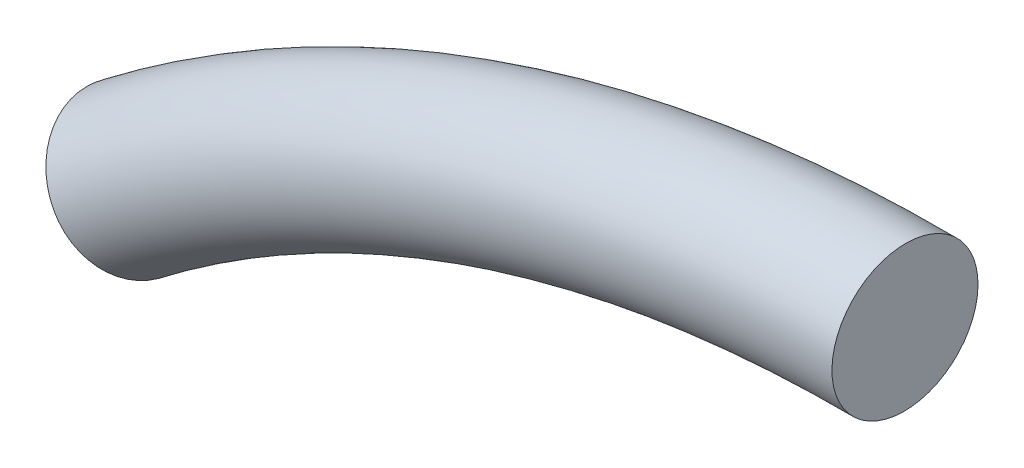
ISO-10303-21;
HEADER;
FILE_DESCRIPTION(('STEP AP214'),'2;1');
FILE_NAME('part.step','',(''),(''),'','','');
FILE_SCHEMA(('AUTOMOTIVE_DESIGN { 1 0 10303 214 1 1 1 1 }'));
ENDSEC;
DATA;
#1=APPLICATION_CONTEXT('core data for automotive mechanical design processes');
#2=APPLICATION_PROTOCOL_DEFINITION('international standard','automotive_design',2000,#1);
#3=PRODUCT_CONTEXT('',#1,'mechanical');
#4=PRODUCT('Part','Part','',(#3));
#5=PRODUCT_RELATED_PRODUCT_CATEGORY('part','',(#4));
#6=PRODUCT_DEFINITION_FORMATION('','',#4);
#7=PRODUCT_DEFINITION_CONTEXT('part definition',#1,'design');
#8=PRODUCT_DEFINITION('design','',#6,#7);
#9=PRODUCT_DEFINITION_SHAPE('','',#8);
#10=(LENGTH_UNIT() NAMED_UNIT(*) SI_UNIT(.MILLI.,.METRE.));
#11=(NAMED_UNIT(*) PLANE_ANGLE_UNIT() SI_UNIT($,.RADIAN.));
#12=(NAMED_UNIT(*) SI_UNIT($,.STERADIAN.) SOLID_ANGLE_UNIT());
#13=UNCERTAINTY_MEASURE_WITH_UNIT(LENGTH_MEASURE(1.E-05),#10,'distance_accuracy_value','');
#14=(GEOMETRIC_REPRESENTATION_CONTEXT(3) GLOBAL_UNCERTAINTY_ASSIGNED_CONTEXT((#13)) GLOBAL_UNIT_ASSIGNED_CONTEXT((#10,
#11,#12)) REPRESENTATION_CONTEXT('',''));
#15=CARTESIAN_POINT('',(0.,0.,0.));
#16=DIRECTION('',(0.,0.,1.));
#17=DIRECTION('',(1.,0.,0.));
#18=AXIS2_PLACEMENT_3D('',#15,#16,#17);
#19=CARTESIAN_POINT('',(0.,0.,-107.5));
#20=DIRECTION('',(0.999955923651329,-0.00938886332935335,0.));
#21=DIRECTION('',(0.00938886332935335,0.999955923651329,0.));
#22=AXIS2_PLACEMENT_3D('',#19,#20,#21);
#23=PLANE('',#22);
#24=CARTESIAN_POINT('',(0.0681835762520842,7.26185573027463,-102.2302));
#25=CARTESIAN_POINT('',(0.0681835589232626,7.26185388467768,-102.25265524156));
#26=CARTESIAN_POINT('',(0.0681657576199172,7.25995796627913,-102.275130857259));
#27=CARTESIAN_POINT('',(0.0680949382572513,7.2524153875108,-102.319482451298));
#28=CARTESIAN_POINT('',(0.0680418448261348,7.24676069970773,-102.341357041711));
#29=CARTESIAN_POINT('',(0.0679020229705332,7.23186904692079,-102.383809618347));
#30=CARTESIAN_POINT('',(0.067815354578601,7.22263847567222,-102.404389843003));
#31=CARTESIAN_POINT('',(0.0676106822649528,7.20083995914679,-102.443737337222));
#32=CARTESIAN_POINT('',(0.0674926338902818,7.18826727943147,-102.46250198299));
#33=CARTESIAN_POINT('',(0.067228803944301,7.16016821055959,-102.497627484938));
#34=CARTESIAN_POINT('',(0.0670830617132299,7.14464601131436,-102.513991693303));
#35=CARTESIAN_POINT('',(0.0667676445744993,7.11105267576022,-102.543904884907));
#36=CARTESIAN_POINT('',(0.0665979364490641,7.0929780016097,-102.557449895039));
#37=CARTESIAN_POINT('',(0.066239698530683,7.05482406156439,-102.581301941874));
#38=CARTESIAN_POINT('',(0.0660511825367067,7.03474626532158,-102.5916113298));
#39=CARTESIAN_POINT('',(0.0656605645775489,6.99314370615733,-102.608713483024));
#40=CARTESIAN_POINT('',(0.0654584618138845,6.9716188581939,-102.615506041437));
#41=CARTESIAN_POINT('',(0.0650464240342418,6.92773499237665,-102.625380612929));
#42=CARTESIAN_POINT('',(0.0648364892487736,6.90537599907318,-102.628462735124));
#43=CARTESIAN_POINT('',(0.0644147411796687,6.86045794401199,-102.630829316177));
#44=CARTESIAN_POINT('',(0.064202927896032,6.83789888225426,-102.630113775036));
#45=CARTESIAN_POINT('',(0.0637834293286717,6.79322040918673,-102.624905254934));
#46=CARTESIAN_POINT('',(0.0635757441665334,6.77110101082632,-102.620412164882));
#47=CARTESIAN_POINT('',(0.063170416447184,6.72793179643204,-102.607776350926));
#48=CARTESIAN_POINT('',(0.0629727733000141,6.70688191756491,-102.599633841699));
#49=CARTESIAN_POINT('',(0.0625929872389772,6.66643300398165,-102.579923114515));
#50=CARTESIAN_POINT('',(0.0624108557280838,6.64703518373318,-102.568352403919));
#51=CARTESIAN_POINT('',(0.0620676737526863,6.61048476893311,-102.542134850302));
#52=CARTESIAN_POINT('',(0.0619065941739791,6.59332907358869,-102.527492330157));
#53=CARTESIAN_POINT('',(0.0616095715876351,6.56169484010866,-102.495513974748));
#54=CARTESIAN_POINT('',(0.0614736643953467,6.54722011646778,-102.478174365578));
#55=CARTESIAN_POINT('',(0.0612313067299153,6.52140794148034,-102.441335318358));
#56=CARTESIAN_POINT('',(0.0611248146384191,6.51006605759308,-102.421838987082));
#57=CARTESIAN_POINT('',(0.0609438850957211,6.49079625233148,-102.381186262625));
#58=CARTESIAN_POINT('',(0.0608695051364039,6.48287445409989,-102.36002697154));
#59=CARTESIAN_POINT('',(0.0607553226134225,6.47071350487448,-102.316713490036));
#60=CARTESIAN_POINT('',(0.0607154464644752,6.46646651671901,-102.294561523395));
#61=CARTESIAN_POINT('',(0.0606794150799669,6.46262901316686,-102.258269762147));
#62=CARTESIAN_POINT('',(0.060672474754741,6.46188983749903,-102.244238862857));
#63=CARTESIAN_POINT('',(0.0606725029174219,6.46189283695052,-102.20774475844));
#64=CARTESIAN_POINT('',(0.0606903042207651,6.46378875534907,-102.185269142741));
#65=CARTESIAN_POINT('',(0.060761123583431,6.47133133411741,-102.140917548703));
#66=CARTESIAN_POINT('',(0.0608142170145498,6.47698602192048,-102.119042958289));
#67=CARTESIAN_POINT('',(0.0609540388701514,6.49187767470741,-102.076590381653));
#68=CARTESIAN_POINT('',(0.0610407072620813,6.50110824595599,-102.056010156997));
#69=CARTESIAN_POINT('',(0.0612453795757295,6.52290676248142,-102.016662662778));
#70=CARTESIAN_POINT('',(0.0613634279504027,6.53547944219674,-101.99789801701));
#71=CARTESIAN_POINT('',(0.0616272578963835,6.56357851106861,-101.962772515062));
#72=CARTESIAN_POINT('',(0.0617730001274524,6.57910071031384,-101.946408306697));
#73=CARTESIAN_POINT('',(0.062088417266183,6.61269404586798,-101.916495115093));
#74=CARTESIAN_POINT('',(0.0622581253916204,6.6307687200185,-101.902950104961));
#75=CARTESIAN_POINT('',(0.0626163633100016,6.66892266006382,-101.879098058126));
#76=CARTESIAN_POINT('',(0.0628048793039756,6.68900045630662,-101.8687886702));
#77=CARTESIAN_POINT('',(0.0631954972631334,6.73060301547087,-101.851686516976));
#78=CARTESIAN_POINT('',(0.0633976000268001,6.7521278634343,-101.844893958563));
#79=CARTESIAN_POINT('',(0.0638096378064428,6.79601172925156,-101.835019387071));
#80=CARTESIAN_POINT('',(0.0640195725919088,6.81837072255502,-101.831937264876));
#81=CARTESIAN_POINT('',(0.0644413206610137,6.86328877761622,-101.829570683823));
#82=CARTESIAN_POINT('',(0.0646531339446526,6.88584783937395,-101.830286224964));
#83=CARTESIAN_POINT('',(0.0650726325120129,6.93052631244147,-101.835494745066));
#84=CARTESIAN_POINT('',(0.0652803176741489,6.95264571080189,-101.839987835118));
#85=CARTESIAN_POINT('',(0.0656856453934983,6.99581492519617,-101.852623649074));
#86=CARTESIAN_POINT('',(0.0658832885406704,7.01686480406329,-101.860766158301));
#87=CARTESIAN_POINT('',(0.0662630746017073,7.05731371764656,-101.880476885485));
#88=CARTESIAN_POINT('',(0.0664452061125985,7.07671153789502,-101.892047596081));
#89=CARTESIAN_POINT('',(0.066788388087996,7.1132619526951,-101.918265149698));
#90=CARTESIAN_POINT('',(0.0669494676667055,7.13041764803951,-101.932907669844));
#91=CARTESIAN_POINT('',(0.0672464902530494,7.16205188151955,-101.964886025252));
#92=CARTESIAN_POINT('',(0.0673823974453356,7.17652660516043,-101.982225634422));
#93=CARTESIAN_POINT('',(0.067624755110767,7.20233878014787,-102.019064681642));
#94=CARTESIAN_POINT('',(0.0677312472022654,7.21368066403513,-102.038561012918));
#95=CARTESIAN_POINT('',(0.0679121767449635,7.23295046929673,-102.079213737375));
#96=CARTESIAN_POINT('',(0.0679865567042786,7.24087226752831,-102.10037302846));
#97=CARTESIAN_POINT('',(0.0681007392272596,7.25303321675372,-102.143686509964));
#98=CARTESIAN_POINT('',(0.0681406153762084,7.2572802049092,-102.165838476605));
#99=CARTESIAN_POINT('',(0.0681766467607183,7.26111770846135,-102.202130237853));
#100=CARTESIAN_POINT('',(0.0681835870859444,7.26185688412918,-102.216161137143));
#101=CARTESIAN_POINT('',(0.0681835762520842,7.26185573027463,-102.2302));
#102=B_SPLINE_CURVE_WITH_KNOTS('',3,(#24,#25,#26,#27,#28,#29,#30,#31,#32,#33,#34,#35,#36,#37,
#38,#39,#40,#41,#42,#43,#44,#45,#46,#47,#48,#49,#50,#51,#52,#53,#54,#55,#56,#57,#58,#59,#60,#61,
#62,#63,#64,#65,#66,#67,#68,#69,#70,#71,#72,#73,#74,#75,#76,#77,#78,#79,#80,#81,#82,#83,#84,#85,
#86,#87,#88,#89,#90,#91,#92,#93,#94,#95,#96,#97,#98,#99,#100,#101),.UNSPECIFIED.,.T.,.F.,(4,2,2,
2,2,2,2,2,2,2,2,2,2,2,2,2,2,2,2,2,2,2,2,2,2,2,2,2,2,2,2,2,2,2,2,2,2,2,4),(0.,0.0673217190940811,
0.134787678055446,0.202133559490878,0.26957535641861,0.336922056232666,0.404363034793443,
0.47175489208364,0.53915071340354,0.606544552708794,0.673938392014052,0.741334213333949,
0.808726070624146,0.876167049184933,0.943513748998996,1.01095554592845,1.07830142736559,
1.1457673863287,1.21308910542448,1.25517818200736,1.32249990110144,1.3899658600628,
1.45731174149823,1.52475353842597,1.59210023824002,1.6595412168008,1.726933074091,
1.7943288954109,1.86172273471615,1.92911657402141,1.99651239534131,2.0639042526315,
2.13134523119229,2.19869193100635,2.2661337279358,2.33347960937294,2.40094556833606,
2.46826728743184,2.51035636401471),.UNSPECIFIED.);
#103=CARTESIAN_POINT('',(0.0681835762520842,7.26185573027463,-102.2302));
#104=VERTEX_POINT('',#103);
#105=EDGE_CURVE('E19',#104,#104,#102,.T.);
#106=ORIENTED_EDGE('',*,*,#105,.F.);
#107=EDGE_LOOP('',(#106));
#108=FACE_BOUND('',#107,.T.);
#109=ADVANCED_FACE('F15',(#108),#23,.T.);
#110=CARTESIAN_POINT('',(0.,0.,-107.5));
#111=DIRECTION('',(0.793756382418969,0.608235813948135,0.));
#112=DIRECTION('',(-0.608235813948135,0.793756382418969,0.));
#113=AXIS2_PLACEMENT_3D('',#110,#111,#112);
#114=PLANE('',#113);
#115=CARTESIAN_POINT('',(-3.93052677003847,5.12939330181018,-102.2302));
#116=CARTESIAN_POINT('',(-3.93052789264611,5.12939476682911,-102.25265524156));
#117=CARTESIAN_POINT('',(-3.931681108946,5.13089973049181,-102.275130857259));
#118=CARTESIAN_POINT('',(-3.93626897769893,5.13688696442448,-102.319482451298));
#119=CARTESIAN_POINT('',(-3.9397085129396,5.14137560680172,-102.341357041711));
#120=CARTESIAN_POINT('',(-3.94876654873864,5.15319647226671,-102.383809618347));
#121=CARTESIAN_POINT('',(-3.9543811602268,5.16052362006256,-102.404389843003));
#122=CARTESIAN_POINT('',(-3.96764038308664,5.17782709435585,-102.443737337222));
#123=CARTESIAN_POINT('',(-3.97528787424028,5.18780717900969,-102.46250198299));
#124=CARTESIAN_POINT('',(-3.99237948760266,5.21011197738084,-102.497627484938));
#125=CARTESIAN_POINT('',(-4.00182106124494,5.2224333651827,-102.513991693303));
#126=CARTESIAN_POINT('',(-4.02225463167612,5.24909946502985,-102.543904884907));
#127=CARTESIAN_POINT('',(-4.03324878040184,5.26344698538328,-102.557449895039));
#128=CARTESIAN_POINT('',(-4.05645639608759,5.2937332537168,-102.581301941874));
#129=CARTESIAN_POINT('',(-4.06866896911324,5.30967083509983,-102.5916113298));
#130=CARTESIAN_POINT('',(-4.09397425091326,5.34269458752785,-102.608713483024));
#131=CARTESIAN_POINT('',(-4.10706701141548,5.35978082607843,-102.615506041437));
#132=CARTESIAN_POINT('',(-4.13375992678627,5.39461546003956,-102.625380612929));
#133=CARTESIAN_POINT('',(-4.14736006672178,5.41236383596226,-102.628462735124));
#134=CARTESIAN_POINT('',(-4.17468204075575,5.44801940042002,-102.630829316177));
#135=CARTESIAN_POINT('',(-4.18840387485421,5.46592658895509,-102.630113775036));
#136=CARTESIAN_POINT('',(-4.21558012011606,5.5013919752939,-102.624905254934));
#137=CARTESIAN_POINT('',(-4.22903452340282,5.51895016281854,-102.620412164882));
#138=CARTESIAN_POINT('',(-4.25529274302387,5.55321751264768,-102.607776350926));
#139=CARTESIAN_POINT('',(-4.26809659757728,5.56992672482866,-102.599633841699));
#140=CARTESIAN_POINT('',(-4.29270015988911,5.60203472335063,-102.579923114515));
#141=CARTESIAN_POINT('',(-4.30449912893223,5.61743254565765,-102.568352403919));
#142=CARTESIAN_POINT('',(-4.32673138014475,5.64644594949017,-102.542134850302));
#143=CARTESIAN_POINT('',(-4.33716654841052,5.66006399239825,-102.527492330157));
#144=CARTESIAN_POINT('',(-4.35640847027353,5.68517497392633,-102.495513974748));
#145=CARTESIAN_POINT('',(-4.36521290365619,5.69666488463334,-102.478174365578));
#146=CARTESIAN_POINT('',(-4.38091348494374,5.71715436637528,-102.441335318358));
#147=CARTESIAN_POINT('',(-4.38781232899747,5.72615745592276,-102.421838987082));
#148=CARTESIAN_POINT('',(-4.39953343130877,5.74145366103799,-102.381186262625));
#149=CARTESIAN_POINT('',(-4.40435196508747,5.74774191610787,-102.36002697154));
#150=CARTESIAN_POINT('',(-4.41174901597296,5.75739517265212,-102.316713490036));
#151=CARTESIAN_POINT('',(-4.41433230013227,5.76076639519776,-102.294561523395));
#152=CARTESIAN_POINT('',(-4.4166665101123,5.76381257239921,-102.258269762147));
#153=CARTESIAN_POINT('',(-4.41711612304356,5.76439932366513,-102.244238862858));
#154=CARTESIAN_POINT('',(-4.41711429858933,5.76439694272642,-102.20774475844));
#155=CARTESIAN_POINT('',(-4.41596108228944,5.76289197906372,-102.185269142741));
#156=CARTESIAN_POINT('',(-4.41137321353652,5.75690474513105,-102.140917548703));
#157=CARTESIAN_POINT('',(-4.40793367829584,5.75241610275381,-102.119042958289));
#158=CARTESIAN_POINT('',(-4.3988756424968,5.74059523728882,-102.076590381653));
#159=CARTESIAN_POINT('',(-4.39326103100865,5.73326808949298,-102.056010156997));
#160=CARTESIAN_POINT('',(-4.38000180814881,5.71596461519968,-102.016662662778));
#161=CARTESIAN_POINT('',(-4.37235431699516,5.70598453054585,-101.99789801701));
#162=CARTESIAN_POINT('',(-4.35526270363278,5.6836797321747,-101.962772515062));
#163=CARTESIAN_POINT('',(-4.3458211299905,5.67135834437283,-101.946408306697));
#164=CARTESIAN_POINT('',(-4.32538755955932,5.64469224452568,-101.916495115093));
#165=CARTESIAN_POINT('',(-4.3143934108336,5.63034472417225,-101.902950104961));
#166=CARTESIAN_POINT('',(-4.29118579514785,5.60005845583873,-101.879098058126));
#167=CARTESIAN_POINT('',(-4.2789732221222,5.5841208744557,-101.8687886702));
#168=CARTESIAN_POINT('',(-4.25366794032218,5.55109712202768,-101.851686516976));
#169=CARTESIAN_POINT('',(-4.24057517981996,5.53401088347711,-101.844893958563));
#170=CARTESIAN_POINT('',(-4.21388226444916,5.49917624951597,-101.835019387071));
#171=CARTESIAN_POINT('',(-4.20028212451366,5.48142787359328,-101.831937264876));
#172=CARTESIAN_POINT('',(-4.17296015047969,5.44577230913551,-101.829570683823));
#173=CARTESIAN_POINT('',(-4.15923831638123,5.42786512060044,-101.830286224964));
#174=CARTESIAN_POINT('',(-4.13206207111938,5.39239973426163,-101.835494745066));
#175=CARTESIAN_POINT('',(-4.11860766783262,5.37484154673699,-101.839987835118));
#176=CARTESIAN_POINT('',(-4.09234944821157,5.34057419690786,-101.852623649074));
#177=CARTESIAN_POINT('',(-4.07954559365816,5.32386498472687,-101.860766158301));
#178=CARTESIAN_POINT('',(-4.05494203134633,5.2917569862049,-101.880476885485));
#179=CARTESIAN_POINT('',(-4.04314306230322,5.27635916389788,-101.892047596081));
#180=CARTESIAN_POINT('',(-4.02091081109069,5.24734576006536,-101.918265149698));
#181=CARTESIAN_POINT('',(-4.01047564282492,5.23372771715729,-101.932907669844));
#182=CARTESIAN_POINT('',(-3.99123372096191,5.2086167356292,-101.964886025252));
#183=CARTESIAN_POINT('',(-3.98242928757925,5.19712682492219,-101.982225634422));
#184=CARTESIAN_POINT('',(-3.9667287062917,5.17663734318025,-102.019064681642));
#185=CARTESIAN_POINT('',(-3.95982986223797,5.16763425363277,-102.038561012918));
#186=CARTESIAN_POINT('',(-3.94810875992667,5.15233804851754,-102.079213737375));
#187=CARTESIAN_POINT('',(-3.94329022614797,5.14604979344766,-102.10037302846));
#188=CARTESIAN_POINT('',(-3.93589317526248,5.13639653690342,-102.143686509964));
#189=CARTESIAN_POINT('',(-3.93330989110317,5.13302531435777,-102.165838476605));
#190=CARTESIAN_POINT('',(-3.93097568112314,5.12997913715632,-102.202130237853));
#191=CARTESIAN_POINT('',(-3.93052606819188,5.1293923858904,-102.216161137143));
#192=CARTESIAN_POINT('',(-3.93052677003847,5.12939330181018,-102.2302));
#193=B_SPLINE_CURVE_WITH_KNOTS('',3,(#115,#116,#117,#118,#119,#120,#121,#122,#123,#124,#125,
#126,#127,#128,#129,#130,#131,#132,#133,#134,#135,#136,#137,#138,#139,#140,#141,#142,#143,#144,
#145,#146,#147,#148,#149,#150,#151,#152,#153,#154,#155,#156,#157,#158,#159,#160,#161,#162,#163,
#164,#165,#166,#167,#168,#169,#170,#171,#172,#173,#174,#175,#176,#177,#178,#179,#180,#181,#182,
#183,#184,#185,#186,#187,#188,#189,#190,#191,#192),.UNSPECIFIED.,.T.,.F.,(4,2,2,2,2,2,2,2,2,2,2,
2,2,2,2,2,2,2,2,2,2,2,2,2,2,2,2,2,2,2,2,2,2,2,2,2,2,2,4),(0.,0.0673217190940812,
0.134787678055445,0.202133559490878,0.269575356418609,0.336922056232666,0.404363034793443,
0.47175489208364,0.53915071340354,0.606544552708795,0.673938392014054,0.741334213333951,
0.808726070624148,0.876167049184933,0.943513748998997,1.01095554592842,1.07830142736557,
1.14576738632868,1.21308910542447,1.25517818200736,1.32249990110144,1.3899658600628,
1.45731174149824,1.52475353842597,1.59210023824002,1.6595412168008,1.726933074091,
1.7943288954109,1.86172273471615,1.92911657402141,1.99651239534131,2.0639042526315,
2.13134523119229,2.19869193100635,2.26613372793578,2.33347960937293,2.40094556833604,
2.46826728743182,2.51035636401472),.UNSPECIFIED.);
#194=CARTESIAN_POINT('',(-3.93052677003847,5.12939330181018,-102.2302));
#195=VERTEX_POINT('',#194);
#196=EDGE_CURVE('E10',#195,#195,#193,.T.);
#197=ORIENTED_EDGE('',*,*,#196,.F.);
#198=EDGE_LOOP('',(#197));
#199=FACE_BOUND('',#198,.T.);
#200=ADVANCED_FACE('F35',(#199),#114,.F.);
#201=CARTESIAN_POINT('',(0.,0.,-102.2302));
#202=DIRECTION('',(0.,0.,1.));
#203=DIRECTION('',(0.999955923651329,-0.00938886332935335,0.));
#204=AXIS2_PLACEMENT_3D('',#201,#202,#203);
#205=TOROIDAL_SURFACE('',#204,6.86217582046821,0.4);
#206=ORIENTED_EDGE('',*,*,#105,.T.);
#207=EDGE_LOOP('',(#206));
#208=FACE_BOUND('',#207,.T.);
#209=ORIENTED_EDGE('',*,*,#196,.T.);
#210=EDGE_LOOP('',(#209));
#211=FACE_BOUND('',#210,.T.);
#212=ADVANCED_FACE('F37',(#208,#211),#205,.T.);
#213=CLOSED_SHELL('',(#109,#200,#212));
#214=MANIFOLD_SOLID_BREP('B1',#213);
#215=ADVANCED_BREP_SHAPE_REPRESENTATION('',(#18,#214),#14);
#216=SHAPE_DEFINITION_REPRESENTATION(#9,#215);
ENDSEC;
END-ISO-10303-21;
